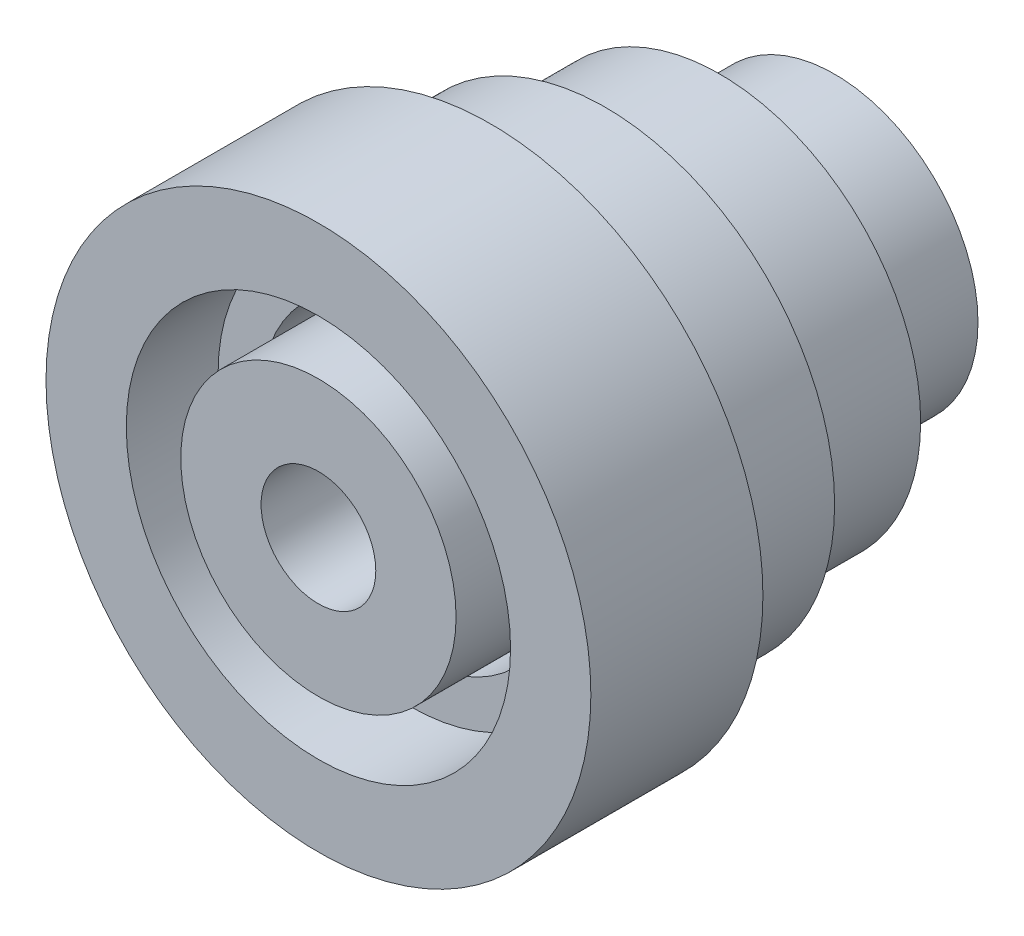
ISO-10303-21;
HEADER;
FILE_DESCRIPTION(('STEP AP214'),'2;1');
FILE_NAME('part.step','',(''),(''),'','','');
FILE_SCHEMA(('AUTOMOTIVE_DESIGN { 1 0 10303 214 1 1 1 1 }'));
ENDSEC;
DATA;
#1=APPLICATION_CONTEXT('core data for automotive mechanical design processes');
#2=APPLICATION_PROTOCOL_DEFINITION('international standard','automotive_design',2000,#1);
#3=PRODUCT_CONTEXT('',#1,'mechanical');
#4=PRODUCT('Part','Part','',(#3));
#5=PRODUCT_RELATED_PRODUCT_CATEGORY('part','',(#4));
#6=PRODUCT_DEFINITION_FORMATION('','',#4);
#7=PRODUCT_DEFINITION_CONTEXT('part definition',#1,'design');
#8=PRODUCT_DEFINITION('design','',#6,#7);
#9=PRODUCT_DEFINITION_SHAPE('','',#8);
#10=(LENGTH_UNIT() NAMED_UNIT(*) SI_UNIT(.MILLI.,.METRE.));
#11=(NAMED_UNIT(*) PLANE_ANGLE_UNIT() SI_UNIT($,.RADIAN.));
#12=(NAMED_UNIT(*) SI_UNIT($,.STERADIAN.) SOLID_ANGLE_UNIT());
#13=UNCERTAINTY_MEASURE_WITH_UNIT(LENGTH_MEASURE(1.E-05),#10,'distance_accuracy_value','');
#14=(GEOMETRIC_REPRESENTATION_CONTEXT(3) GLOBAL_UNCERTAINTY_ASSIGNED_CONTEXT((#13)) GLOBAL_UNIT_ASSIGNED_CONTEXT((#10,
#11,#12)) REPRESENTATION_CONTEXT('',''));
#15=CARTESIAN_POINT('',(0.,0.,0.));
#16=DIRECTION('',(0.,0.,1.));
#17=DIRECTION('',(1.,0.,0.));
#18=AXIS2_PLACEMENT_3D('',#15,#16,#17);
#19=CARTESIAN_POINT('',(0.,0.,0.));
#20=DIRECTION('',(0.,0.,1.));
#21=DIRECTION('',(1.,0.,0.));
#22=AXIS2_PLACEMENT_3D('',#19,#20,#21);
#23=CYLINDRICAL_SURFACE('',#22,48.);
#24=CARTESIAN_POINT('',(0.,0.,10.));
#25=DIRECTION('',(0.,0.,1.));
#26=DIRECTION('',(1.,0.,0.));
#27=AXIS2_PLACEMENT_3D('',#24,#25,#26);
#28=CIRCLE('',#27,48.);
#29=CARTESIAN_POINT('',(48.,0.,10.));
#30=VERTEX_POINT('',#29);
#31=EDGE_CURVE('E89',#30,#30,#28,.T.);
#32=ORIENTED_EDGE('',*,*,#31,.F.);
#33=EDGE_LOOP('',(#32));
#34=FACE_BOUND('',#33,.T.);
#35=CARTESIAN_POINT('',(0.,0.,-62.));
#36=DIRECTION('',(0.,0.,1.));
#37=DIRECTION('',(1.,0.,0.));
#38=AXIS2_PLACEMENT_3D('',#35,#36,#37);
#39=CIRCLE('',#38,48.);
#40=CARTESIAN_POINT('',(48.,0.,-62.));
#41=VERTEX_POINT('',#40);
#42=EDGE_CURVE('E10',#41,#41,#39,.T.);
#43=ORIENTED_EDGE('',*,*,#42,.T.);
#44=EDGE_LOOP('',(#43));
#45=FACE_BOUND('',#44,.T.);
#46=ADVANCED_FACE('F36',(#34,#45),#23,.T.);
#47=CARTESIAN_POINT('',(0.,0.,-62.));
#48=DIRECTION('',(0.,0.,-1.));
#49=DIRECTION('',(-1.,0.,0.));
#50=AXIS2_PLACEMENT_3D('',#47,#48,#49);
#51=PLANE('',#50);
#52=ORIENTED_EDGE('',*,*,#42,.F.);
#53=EDGE_LOOP('',(#52));
#54=FACE_BOUND('',#53,.T.);
#55=CARTESIAN_POINT('',(0.,0.,-62.));
#56=DIRECTION('',(0.,0.,1.));
#57=DIRECTION('',(1.,0.,0.));
#58=AXIS2_PLACEMENT_3D('',#55,#56,#57);
#59=CIRCLE('',#58,52.);
#60=CARTESIAN_POINT('',(52.,0.,-62.));
#61=VERTEX_POINT('',#60);
#62=EDGE_CURVE('E42',#61,#61,#59,.T.);
#63=ORIENTED_EDGE('',*,*,#62,.T.);
#64=EDGE_LOOP('',(#63));
#65=FACE_BOUND('',#64,.T.);
#66=ADVANCED_FACE('F234',(#54,#65),#51,.F.);
#67=CARTESIAN_POINT('',(0.,0.,0.));
#68=DIRECTION('',(0.,0.,1.));
#69=DIRECTION('',(1.,0.,0.));
#70=AXIS2_PLACEMENT_3D('',#67,#68,#69);
#71=CYLINDRICAL_SURFACE('',#70,52.);
#72=ORIENTED_EDGE('',*,*,#62,.F.);
#73=EDGE_LOOP('',(#72));
#74=FACE_BOUND('',#73,.T.);
#75=CARTESIAN_POINT('',(0.,0.,-22.));
#76=DIRECTION('',(0.,0.,1.));
#77=DIRECTION('',(1.,0.,0.));
#78=AXIS2_PLACEMENT_3D('',#75,#76,#77);
#79=CIRCLE('',#78,52.);
#80=CARTESIAN_POINT('',(52.,0.,-22.));
#81=VERTEX_POINT('',#80);
#82=EDGE_CURVE('E48',#81,#81,#79,.T.);
#83=ORIENTED_EDGE('',*,*,#82,.T.);
#84=EDGE_LOOP('',(#83));
#85=FACE_BOUND('',#84,.T.);
#86=ADVANCED_FACE('F235',(#74,#85),#71,.F.);
#87=CARTESIAN_POINT('',(0.,0.,-22.));
#88=DIRECTION('',(0.,0.,-1.));
#89=DIRECTION('',(-1.,0.,0.));
#90=AXIS2_PLACEMENT_3D('',#87,#88,#89);
#91=PLANE('',#90);
#92=ORIENTED_EDGE('',*,*,#82,.F.);
#93=EDGE_LOOP('',(#92));
#94=FACE_BOUND('',#93,.T.);
#95=CARTESIAN_POINT('',(0.,0.,-22.));
#96=DIRECTION('',(0.,0.,1.));
#97=DIRECTION('',(1.,0.,0.));
#98=AXIS2_PLACEMENT_3D('',#95,#96,#97);
#99=CIRCLE('',#98,67.);
#100=CARTESIAN_POINT('',(67.,0.,-22.));
#101=VERTEX_POINT('',#100);
#102=EDGE_CURVE('E55',#101,#101,#99,.T.);
#103=ORIENTED_EDGE('',*,*,#102,.T.);
#104=EDGE_LOOP('',(#103));
#105=FACE_BOUND('',#104,.T.);
#106=ADVANCED_FACE('F230',(#94,#105),#91,.F.);
#107=CARTESIAN_POINT('',(0.,0.,0.));
#108=DIRECTION('',(0.,0.,1.));
#109=DIRECTION('',(1.,0.,0.));
#110=AXIS2_PLACEMENT_3D('',#107,#108,#109);
#111=CYLINDRICAL_SURFACE('',#110,67.);
#112=ORIENTED_EDGE('',*,*,#102,.F.);
#113=EDGE_LOOP('',(#112));
#114=FACE_BOUND('',#113,.T.);
#115=CARTESIAN_POINT('',(0.,0.,10.));
#116=DIRECTION('',(0.,0.,1.));
#117=DIRECTION('',(1.,0.,0.));
#118=AXIS2_PLACEMENT_3D('',#115,#116,#117);
#119=CIRCLE('',#118,67.);
#120=CARTESIAN_POINT('',(67.,0.,10.));
#121=VERTEX_POINT('',#120);
#122=EDGE_CURVE('E60',#121,#121,#119,.T.);
#123=ORIENTED_EDGE('',*,*,#122,.T.);
#124=EDGE_LOOP('',(#123));
#125=FACE_BOUND('',#124,.T.);
#126=ADVANCED_FACE('F221',(#114,#125),#111,.F.);
#127=CARTESIAN_POINT('',(0.,0.,10.));
#128=DIRECTION('',(0.,0.,1.));
#129=DIRECTION('',(1.,0.,0.));
#130=AXIS2_PLACEMENT_3D('',#127,#128,#129);
#131=PLANE('',#130);
#132=CARTESIAN_POINT('',(0.,0.,10.));
#133=DIRECTION('',(0.,0.,1.));
#134=DIRECTION('',(1.,0.,0.));
#135=AXIS2_PLACEMENT_3D('',#132,#133,#134);
#136=CIRCLE('',#135,95.);
#137=CARTESIAN_POINT('',(95.,0.,10.));
#138=VERTEX_POINT('',#137);
#139=EDGE_CURVE('E58',#138,#138,#136,.T.);
#140=ORIENTED_EDGE('',*,*,#139,.T.);
#141=EDGE_LOOP('',(#140));
#142=FACE_BOUND('',#141,.T.);
#143=ORIENTED_EDGE('',*,*,#122,.F.);
#144=EDGE_LOOP('',(#143));
#145=FACE_BOUND('',#144,.T.);
#146=ADVANCED_FACE('F219',(#142,#145),#131,.T.);
#147=CARTESIAN_POINT('',(0.,0.,0.));
#148=DIRECTION('',(0.,0.,1.));
#149=DIRECTION('',(1.,0.,0.));
#150=AXIS2_PLACEMENT_3D('',#147,#148,#149);
#151=CYLINDRICAL_SURFACE('',#150,95.);
#152=CARTESIAN_POINT('',(0.,0.,-50.));
#153=DIRECTION('',(0.,0.,1.));
#154=DIRECTION('',(1.,0.,0.));
#155=AXIS2_PLACEMENT_3D('',#152,#153,#154);
#156=CIRCLE('',#155,95.);
#157=CARTESIAN_POINT('',(95.,0.,-50.));
#158=VERTEX_POINT('',#157);
#159=EDGE_CURVE('E65',#158,#158,#156,.T.);
#160=ORIENTED_EDGE('',*,*,#159,.T.);
#161=EDGE_LOOP('',(#160));
#162=FACE_BOUND('',#161,.T.);
#163=ORIENTED_EDGE('',*,*,#139,.F.);
#164=EDGE_LOOP('',(#163));
#165=FACE_BOUND('',#164,.T.);
#166=ADVANCED_FACE('F216',(#162,#165),#151,.T.);
#167=CARTESIAN_POINT('',(0.,0.,-50.));
#168=DIRECTION('',(0.,0.,-1.));
#169=DIRECTION('',(-1.,0.,0.));
#170=AXIS2_PLACEMENT_3D('',#167,#168,#169);
#171=PLANE('',#170);
#172=CARTESIAN_POINT('',(0.,0.,-50.));
#173=DIRECTION('',(0.,0.,1.));
#174=DIRECTION('',(1.,0.,0.));
#175=AXIS2_PLACEMENT_3D('',#172,#173,#174);
#176=CIRCLE('',#175,80.);
#177=CARTESIAN_POINT('',(80.,0.,-50.));
#178=VERTEX_POINT('',#177);
#179=EDGE_CURVE('E66',#178,#178,#176,.T.);
#180=ORIENTED_EDGE('',*,*,#179,.T.);
#181=EDGE_LOOP('',(#180));
#182=FACE_BOUND('',#181,.T.);
#183=ORIENTED_EDGE('',*,*,#159,.F.);
#184=EDGE_LOOP('',(#183));
#185=FACE_BOUND('',#184,.T.);
#186=ADVANCED_FACE('F215',(#182,#185),#171,.T.);
#187=CARTESIAN_POINT('',(0.,0.,0.));
#188=DIRECTION('',(0.,0.,1.));
#189=DIRECTION('',(1.,0.,0.));
#190=AXIS2_PLACEMENT_3D('',#187,#188,#189);
#191=CYLINDRICAL_SURFACE('',#190,80.);
#192=CARTESIAN_POINT('',(0.,0.,-90.));
#193=DIRECTION('',(0.,0.,1.));
#194=DIRECTION('',(1.,0.,0.));
#195=AXIS2_PLACEMENT_3D('',#192,#193,#194);
#196=CIRCLE('',#195,80.);
#197=CARTESIAN_POINT('',(80.,0.,-90.));
#198=VERTEX_POINT('',#197);
#199=EDGE_CURVE('E67',#198,#198,#196,.T.);
#200=ORIENTED_EDGE('',*,*,#199,.T.);
#201=EDGE_LOOP('',(#200));
#202=FACE_BOUND('',#201,.T.);
#203=ORIENTED_EDGE('',*,*,#179,.F.);
#204=EDGE_LOOP('',(#203));
#205=FACE_BOUND('',#204,.T.);
#206=ADVANCED_FACE('F208',(#202,#205),#191,.T.);
#207=CARTESIAN_POINT('',(0.,0.,-90.));
#208=DIRECTION('',(0.,0.,-1.));
#209=DIRECTION('',(-1.,0.,0.));
#210=AXIS2_PLACEMENT_3D('',#207,#208,#209);
#211=PLANE('',#210);
#212=CARTESIAN_POINT('',(0.,0.,-90.));
#213=DIRECTION('',(0.,0.,1.));
#214=DIRECTION('',(1.,0.,0.));
#215=AXIS2_PLACEMENT_3D('',#212,#213,#214);
#216=CIRCLE('',#215,70.);
#217=CARTESIAN_POINT('',(70.,0.,-90.));
#218=VERTEX_POINT('',#217);
#219=EDGE_CURVE('E75',#218,#218,#216,.T.);
#220=ORIENTED_EDGE('',*,*,#219,.T.);
#221=EDGE_LOOP('',(#220));
#222=FACE_BOUND('',#221,.T.);
#223=ORIENTED_EDGE('',*,*,#199,.F.);
#224=EDGE_LOOP('',(#223));
#225=FACE_BOUND('',#224,.T.);
#226=ADVANCED_FACE('F204',(#222,#225),#211,.T.);
#227=CARTESIAN_POINT('',(0.,0.,0.));
#228=DIRECTION('',(0.,0.,1.));
#229=DIRECTION('',(1.,0.,0.));
#230=AXIS2_PLACEMENT_3D('',#227,#228,#229);
#231=CYLINDRICAL_SURFACE('',#230,70.);
#232=CARTESIAN_POINT('',(0.,0.,-130.));
#233=DIRECTION('',(0.,0.,1.));
#234=DIRECTION('',(1.,0.,0.));
#235=AXIS2_PLACEMENT_3D('',#232,#233,#234);
#236=CIRCLE('',#235,70.);
#237=CARTESIAN_POINT('',(70.,0.,-130.));
#238=VERTEX_POINT('',#237);
#239=EDGE_CURVE('E73',#238,#238,#236,.T.);
#240=ORIENTED_EDGE('',*,*,#239,.T.);
#241=EDGE_LOOP('',(#240));
#242=FACE_BOUND('',#241,.T.);
#243=ORIENTED_EDGE('',*,*,#219,.F.);
#244=EDGE_LOOP('',(#243));
#245=FACE_BOUND('',#244,.T.);
#246=ADVANCED_FACE('F199',(#242,#245),#231,.T.);
#247=CARTESIAN_POINT('',(0.,0.,-130.));
#248=DIRECTION('',(0.,0.,-1.));
#249=DIRECTION('',(-1.,0.,0.));
#250=AXIS2_PLACEMENT_3D('',#247,#248,#249);
#251=PLANE('',#250);
#252=CARTESIAN_POINT('',(0.,0.,-130.));
#253=DIRECTION('',(0.,0.,1.));
#254=DIRECTION('',(1.,0.,0.));
#255=AXIS2_PLACEMENT_3D('',#252,#253,#254);
#256=CIRCLE('',#255,50.);
#257=CARTESIAN_POINT('',(50.,0.,-130.));
#258=VERTEX_POINT('',#257);
#259=EDGE_CURVE('E80',#258,#258,#256,.T.);
#260=ORIENTED_EDGE('',*,*,#259,.T.);
#261=EDGE_LOOP('',(#260));
#262=FACE_BOUND('',#261,.T.);
#263=ORIENTED_EDGE('',*,*,#239,.F.);
#264=EDGE_LOOP('',(#263));
#265=FACE_BOUND('',#264,.T.);
#266=ADVANCED_FACE('F198',(#262,#265),#251,.T.);
#267=CARTESIAN_POINT('',(0.,0.,0.));
#268=DIRECTION('',(0.,0.,1.));
#269=DIRECTION('',(1.,0.,0.));
#270=AXIS2_PLACEMENT_3D('',#267,#268,#269);
#271=CYLINDRICAL_SURFACE('',#270,50.);
#272=CARTESIAN_POINT('',(0.,0.,-170.));
#273=DIRECTION('',(0.,0.,1.));
#274=DIRECTION('',(1.,0.,0.));
#275=AXIS2_PLACEMENT_3D('',#272,#273,#274);
#276=CIRCLE('',#275,50.);
#277=CARTESIAN_POINT('',(50.,0.,-170.));
#278=VERTEX_POINT('',#277);
#279=EDGE_CURVE('E81',#278,#278,#276,.T.);
#280=ORIENTED_EDGE('',*,*,#279,.T.);
#281=EDGE_LOOP('',(#280));
#282=FACE_BOUND('',#281,.T.);
#283=ORIENTED_EDGE('',*,*,#259,.F.);
#284=EDGE_LOOP('',(#283));
#285=FACE_BOUND('',#284,.T.);
#286=ADVANCED_FACE('F195',(#282,#285),#271,.T.);
#287=CARTESIAN_POINT('',(4.71844785465693E-13,0.,-170.));
#288=DIRECTION('',(0.,0.,-1.));
#289=DIRECTION('',(-1.,0.,0.));
#290=AXIS2_PLACEMENT_3D('',#287,#288,#289);
#291=PLANE('',#290);
#292=CARTESIAN_POINT('',(0.,0.,-170.));
#293=DIRECTION('',(0.,0.,1.));
#294=DIRECTION('',(1.,0.,0.));
#295=AXIS2_PLACEMENT_3D('',#292,#293,#294);
#296=CIRCLE('',#295,20.);
#297=CARTESIAN_POINT('',(20.,0.,-170.));
#298=VERTEX_POINT('',#297);
#299=EDGE_CURVE('E82',#298,#298,#296,.T.);
#300=ORIENTED_EDGE('',*,*,#299,.T.);
#301=EDGE_LOOP('',(#300));
#302=FACE_BOUND('',#301,.T.);
#303=ORIENTED_EDGE('',*,*,#279,.F.);
#304=EDGE_LOOP('',(#303));
#305=FACE_BOUND('',#304,.T.);
#306=ADVANCED_FACE('F190',(#302,#305),#291,.T.);
#307=CARTESIAN_POINT('',(0.,0.,0.));
#308=DIRECTION('',(0.,0.,1.));
#309=DIRECTION('',(1.,0.,0.));
#310=AXIS2_PLACEMENT_3D('',#307,#308,#309);
#311=CYLINDRICAL_SURFACE('',#310,20.);
#312=ORIENTED_EDGE('',*,*,#299,.F.);
#313=EDGE_LOOP('',(#312));
#314=FACE_BOUND('',#313,.T.);
#315=CARTESIAN_POINT('',(0.,0.,10.));
#316=DIRECTION('',(0.,0.,1.));
#317=DIRECTION('',(1.,0.,0.));
#318=AXIS2_PLACEMENT_3D('',#315,#316,#317);
#319=CIRCLE('',#318,20.);
#320=CARTESIAN_POINT('',(20.,0.,10.));
#321=VERTEX_POINT('',#320);
#322=EDGE_CURVE('E87',#321,#321,#319,.T.);
#323=ORIENTED_EDGE('',*,*,#322,.T.);
#324=EDGE_LOOP('',(#323));
#325=FACE_BOUND('',#324,.T.);
#326=ADVANCED_FACE('F184',(#314,#325),#311,.F.);
#327=CARTESIAN_POINT('',(0.,0.,10.));
#328=DIRECTION('',(0.,0.,1.));
#329=DIRECTION('',(1.,0.,0.));
#330=AXIS2_PLACEMENT_3D('',#327,#328,#329);
#331=PLANE('',#330);
#332=ORIENTED_EDGE('',*,*,#31,.T.);
#333=EDGE_LOOP('',(#332));
#334=FACE_BOUND('',#333,.T.);
#335=ORIENTED_EDGE('',*,*,#322,.F.);
#336=EDGE_LOOP('',(#335));
#337=FACE_BOUND('',#336,.T.);
#338=ADVANCED_FACE('F185',(#334,#337),#331,.T.);
#339=CLOSED_SHELL('',(#46,#66,#86,#106,#126,#146,#166,#186,#206,#226,#246,#266,#286,#306,#326,#338));
#340=CARTESIAN_POINT('',(0.,0.,0.));
#341=DIRECTION('',(0.,0.,1.));
#342=DIRECTION('',(1.,0.,0.));
#343=AXIS2_PLACEMENT_3D('',#340,#341,#342);
#344=CYLINDRICAL_SURFACE('',#343,38.);
#345=CARTESIAN_POINT('',(0.,0.,0.));
#346=DIRECTION('',(0.,0.,1.));
#347=DIRECTION('',(1.,0.,0.));
#348=AXIS2_PLACEMENT_3D('',#345,#346,#347);
#349=CIRCLE('',#348,38.);
#350=CARTESIAN_POINT('',(38.,0.,0.));
#351=VERTEX_POINT('',#350);
#352=EDGE_CURVE('E145',#351,#351,#349,.T.);
#353=ORIENTED_EDGE('',*,*,#352,.T.);
#354=EDGE_LOOP('',(#353));
#355=FACE_BOUND('',#354,.T.);
#356=CARTESIAN_POINT('',(0.,0.,-112.));
#357=DIRECTION('',(0.,0.,1.));
#358=DIRECTION('',(1.,0.,0.));
#359=AXIS2_PLACEMENT_3D('',#356,#357,#358);
#360=CIRCLE('',#359,38.);
#361=CARTESIAN_POINT('',(38.,0.,-112.));
#362=VERTEX_POINT('',#361);
#363=EDGE_CURVE('E91',#362,#362,#360,.T.);
#364=ORIENTED_EDGE('',*,*,#363,.F.);
#365=EDGE_LOOP('',(#364));
#366=FACE_BOUND('',#365,.T.);
#367=ADVANCED_FACE('F146',(#355,#366),#344,.F.);
#368=CARTESIAN_POINT('',(0.,0.,-112.));
#369=DIRECTION('',(0.,0.,-1.));
#370=DIRECTION('',(-1.,0.,0.));
#371=AXIS2_PLACEMENT_3D('',#368,#369,#370);
#372=PLANE('',#371);
#373=ORIENTED_EDGE('',*,*,#363,.T.);
#374=EDGE_LOOP('',(#373));
#375=FACE_BOUND('',#374,.T.);
#376=CARTESIAN_POINT('',(0.,0.,-112.));
#377=DIRECTION('',(0.,0.,1.));
#378=DIRECTION('',(1.,0.,0.));
#379=AXIS2_PLACEMENT_3D('',#376,#377,#378);
#380=CIRCLE('',#379,52.);
#381=CARTESIAN_POINT('',(52.,0.,-112.));
#382=VERTEX_POINT('',#381);
#383=EDGE_CURVE('E96',#382,#382,#380,.T.);
#384=ORIENTED_EDGE('',*,*,#383,.F.);
#385=EDGE_LOOP('',(#384));
#386=FACE_BOUND('',#385,.T.);
#387=ADVANCED_FACE('F174',(#375,#386),#372,.T.);
#388=CARTESIAN_POINT('',(0.,0.,0.));
#389=DIRECTION('',(0.,0.,1.));
#390=DIRECTION('',(1.,0.,0.));
#391=AXIS2_PLACEMENT_3D('',#388,#389,#390);
#392=CYLINDRICAL_SURFACE('',#391,52.);
#393=ORIENTED_EDGE('',*,*,#383,.T.);
#394=EDGE_LOOP('',(#393));
#395=FACE_BOUND('',#394,.T.);
#396=CARTESIAN_POINT('',(0.,0.,-72.));
#397=DIRECTION('',(0.,0.,1.));
#398=DIRECTION('',(1.,0.,0.));
#399=AXIS2_PLACEMENT_3D('',#396,#397,#398);
#400=CIRCLE('',#399,52.);
#401=CARTESIAN_POINT('',(52.,0.,-72.));
#402=VERTEX_POINT('',#401);
#403=EDGE_CURVE('E97',#402,#402,#400,.T.);
#404=ORIENTED_EDGE('',*,*,#403,.F.);
#405=EDGE_LOOP('',(#404));
#406=FACE_BOUND('',#405,.T.);
#407=ADVANCED_FACE('F180',(#395,#406),#392,.T.);
#408=CARTESIAN_POINT('',(0.,0.,-72.));
#409=DIRECTION('',(0.,0.,-1.));
#410=DIRECTION('',(-1.,0.,0.));
#411=AXIS2_PLACEMENT_3D('',#408,#409,#410);
#412=PLANE('',#411);
#413=ORIENTED_EDGE('',*,*,#403,.T.);
#414=EDGE_LOOP('',(#413));
#415=FACE_BOUND('',#414,.T.);
#416=CARTESIAN_POINT('',(0.,0.,-72.));
#417=DIRECTION('',(0.,0.,1.));
#418=DIRECTION('',(1.,0.,0.));
#419=AXIS2_PLACEMENT_3D('',#416,#417,#418);
#420=CIRCLE('',#419,62.);
#421=CARTESIAN_POINT('',(62.,0.,-72.));
#422=VERTEX_POINT('',#421);
#423=EDGE_CURVE('E105',#422,#422,#420,.T.);
#424=ORIENTED_EDGE('',*,*,#423,.F.);
#425=EDGE_LOOP('',(#424));
#426=FACE_BOUND('',#425,.T.);
#427=ADVANCED_FACE('F360',(#415,#426),#412,.T.);
#428=CARTESIAN_POINT('',(0.,0.,0.));
#429=DIRECTION('',(0.,0.,1.));
#430=DIRECTION('',(1.,0.,0.));
#431=AXIS2_PLACEMENT_3D('',#428,#429,#430);
#432=CYLINDRICAL_SURFACE('',#431,62.);
#433=ORIENTED_EDGE('',*,*,#423,.T.);
#434=EDGE_LOOP('',(#433));
#435=FACE_BOUND('',#434,.T.);
#436=CARTESIAN_POINT('',(0.,0.,-32.));
#437=DIRECTION('',(0.,0.,1.));
#438=DIRECTION('',(1.,0.,0.));
#439=AXIS2_PLACEMENT_3D('',#436,#437,#438);
#440=CIRCLE('',#439,62.);
#441=CARTESIAN_POINT('',(62.,0.,-32.));
#442=VERTEX_POINT('',#441);
#443=EDGE_CURVE('E104',#442,#442,#440,.T.);
#444=ORIENTED_EDGE('',*,*,#443,.F.);
#445=EDGE_LOOP('',(#444));
#446=FACE_BOUND('',#445,.T.);
#447=ADVANCED_FACE('F368',(#435,#446),#432,.T.);
#448=CARTESIAN_POINT('',(0.,0.,-32.));
#449=DIRECTION('',(0.,0.,-1.));
#450=DIRECTION('',(-1.,0.,0.));
#451=AXIS2_PLACEMENT_3D('',#448,#449,#450);
#452=PLANE('',#451);
#453=ORIENTED_EDGE('',*,*,#443,.T.);
#454=EDGE_LOOP('',(#453));
#455=FACE_BOUND('',#454,.T.);
#456=CARTESIAN_POINT('',(0.,0.,-32.));
#457=DIRECTION('',(0.,0.,1.));
#458=DIRECTION('',(1.,0.,0.));
#459=AXIS2_PLACEMENT_3D('',#456,#457,#458);
#460=CIRCLE('',#459,77.);
#461=CARTESIAN_POINT('',(77.,0.,-32.));
#462=VERTEX_POINT('',#461);
#463=EDGE_CURVE('E107',#462,#462,#460,.T.);
#464=ORIENTED_EDGE('',*,*,#463,.F.);
#465=EDGE_LOOP('',(#464));
#466=FACE_BOUND('',#465,.T.);
#467=ADVANCED_FACE('F376',(#455,#466),#452,.T.);
#468=CARTESIAN_POINT('',(0.,0.,0.));
#469=DIRECTION('',(0.,0.,1.));
#470=DIRECTION('',(1.,0.,0.));
#471=AXIS2_PLACEMENT_3D('',#468,#469,#470);
#472=CYLINDRICAL_SURFACE('',#471,77.);
#473=ORIENTED_EDGE('',*,*,#463,.T.);
#474=EDGE_LOOP('',(#473));
#475=FACE_BOUND('',#474,.T.);
#476=CARTESIAN_POINT('',(0.,0.,0.));
#477=DIRECTION('',(0.,0.,1.));
#478=DIRECTION('',(1.,0.,0.));
#479=AXIS2_PLACEMENT_3D('',#476,#477,#478);
#480=CIRCLE('',#479,77.);
#481=CARTESIAN_POINT('',(77.,0.,0.));
#482=VERTEX_POINT('',#481);
#483=EDGE_CURVE('E112',#482,#482,#480,.T.);
#484=ORIENTED_EDGE('',*,*,#483,.F.);
#485=EDGE_LOOP('',(#484));
#486=FACE_BOUND('',#485,.T.);
#487=ADVANCED_FACE('F387',(#475,#486),#472,.T.);
#488=CARTESIAN_POINT('',(0.,0.,0.));
#489=DIRECTION('',(0.,0.,1.));
#490=DIRECTION('',(1.,0.,0.));
#491=AXIS2_PLACEMENT_3D('',#488,#489,#490);
#492=PLANE('',#491);
#493=CARTESIAN_POINT('',(0.,0.,0.));
#494=DIRECTION('',(0.,0.,1.));
#495=DIRECTION('',(1.,0.,0.));
#496=AXIS2_PLACEMENT_3D('',#493,#494,#495);
#497=CIRCLE('',#496,85.);
#498=CARTESIAN_POINT('',(85.,0.,0.));
#499=VERTEX_POINT('',#498);
#500=EDGE_CURVE('E111',#499,#499,#497,.T.);
#501=ORIENTED_EDGE('',*,*,#500,.F.);
#502=EDGE_LOOP('',(#501));
#503=FACE_BOUND('',#502,.T.);
#504=ORIENTED_EDGE('',*,*,#483,.T.);
#505=EDGE_LOOP('',(#504));
#506=FACE_BOUND('',#505,.T.);
#507=ADVANCED_FACE('F396',(#503,#506),#492,.F.);
#508=CARTESIAN_POINT('',(0.,0.,0.));
#509=DIRECTION('',(0.,0.,1.));
#510=DIRECTION('',(1.,0.,0.));
#511=AXIS2_PLACEMENT_3D('',#508,#509,#510);
#512=CYLINDRICAL_SURFACE('',#511,85.);
#513=CARTESIAN_POINT('',(0.,0.,-40.));
#514=DIRECTION('',(0.,0.,1.));
#515=DIRECTION('',(1.,0.,0.));
#516=AXIS2_PLACEMENT_3D('',#513,#514,#515);
#517=CIRCLE('',#516,85.);
#518=CARTESIAN_POINT('',(85.,0.,-40.));
#519=VERTEX_POINT('',#518);
#520=EDGE_CURVE('E116',#519,#519,#517,.T.);
#521=ORIENTED_EDGE('',*,*,#520,.F.);
#522=EDGE_LOOP('',(#521));
#523=FACE_BOUND('',#522,.T.);
#524=ORIENTED_EDGE('',*,*,#500,.T.);
#525=EDGE_LOOP('',(#524));
#526=FACE_BOUND('',#525,.T.);
#527=ADVANCED_FACE('F409',(#523,#526),#512,.F.);
#528=CARTESIAN_POINT('',(0.,0.,-40.));
#529=DIRECTION('',(0.,0.,-1.));
#530=DIRECTION('',(-1.,0.,0.));
#531=AXIS2_PLACEMENT_3D('',#528,#529,#530);
#532=PLANE('',#531);
#533=CARTESIAN_POINT('',(0.,0.,-40.));
#534=DIRECTION('',(0.,0.,1.));
#535=DIRECTION('',(1.,0.,0.));
#536=AXIS2_PLACEMENT_3D('',#533,#534,#535);
#537=CIRCLE('',#536,70.);
#538=CARTESIAN_POINT('',(70.,0.,-40.));
#539=VERTEX_POINT('',#538);
#540=EDGE_CURVE('E117',#539,#539,#537,.T.);
#541=ORIENTED_EDGE('',*,*,#540,.F.);
#542=EDGE_LOOP('',(#541));
#543=FACE_BOUND('',#542,.T.);
#544=ORIENTED_EDGE('',*,*,#520,.T.);
#545=EDGE_LOOP('',(#544));
#546=FACE_BOUND('',#545,.T.);
#547=ADVANCED_FACE('F418',(#543,#546),#532,.F.);
#548=CARTESIAN_POINT('',(0.,0.,0.));
#549=DIRECTION('',(0.,0.,1.));
#550=DIRECTION('',(1.,0.,0.));
#551=AXIS2_PLACEMENT_3D('',#548,#549,#550);
#552=CYLINDRICAL_SURFACE('',#551,70.);
#553=CARTESIAN_POINT('',(0.,0.,-80.));
#554=DIRECTION('',(0.,0.,1.));
#555=DIRECTION('',(1.,0.,0.));
#556=AXIS2_PLACEMENT_3D('',#553,#554,#555);
#557=CIRCLE('',#556,70.);
#558=CARTESIAN_POINT('',(70.,0.,-80.));
#559=VERTEX_POINT('',#558);
#560=EDGE_CURVE('E123',#559,#559,#557,.T.);
#561=ORIENTED_EDGE('',*,*,#560,.F.);
#562=EDGE_LOOP('',(#561));
#563=FACE_BOUND('',#562,.T.);
#564=ORIENTED_EDGE('',*,*,#540,.T.);
#565=EDGE_LOOP('',(#564));
#566=FACE_BOUND('',#565,.T.);
#567=ADVANCED_FACE('F426',(#563,#566),#552,.F.);
#568=CARTESIAN_POINT('',(0.,0.,-80.));
#569=DIRECTION('',(0.,0.,-1.));
#570=DIRECTION('',(-1.,0.,0.));
#571=AXIS2_PLACEMENT_3D('',#568,#569,#570);
#572=PLANE('',#571);
#573=CARTESIAN_POINT('',(0.,0.,-80.));
#574=DIRECTION('',(0.,0.,1.));
#575=DIRECTION('',(1.,0.,0.));
#576=AXIS2_PLACEMENT_3D('',#573,#574,#575);
#577=CIRCLE('',#576,60.);
#578=CARTESIAN_POINT('',(60.,0.,-80.));
#579=VERTEX_POINT('',#578);
#580=EDGE_CURVE('E127',#579,#579,#577,.T.);
#581=ORIENTED_EDGE('',*,*,#580,.F.);
#582=EDGE_LOOP('',(#581));
#583=FACE_BOUND('',#582,.T.);
#584=ORIENTED_EDGE('',*,*,#560,.T.);
#585=EDGE_LOOP('',(#584));
#586=FACE_BOUND('',#585,.T.);
#587=ADVANCED_FACE('F436',(#583,#586),#572,.F.);
#588=CARTESIAN_POINT('',(0.,0.,0.));
#589=DIRECTION('',(0.,0.,1.));
#590=DIRECTION('',(1.,0.,0.));
#591=AXIS2_PLACEMENT_3D('',#588,#589,#590);
#592=CYLINDRICAL_SURFACE('',#591,60.);
#593=CARTESIAN_POINT('',(0.,0.,-120.));
#594=DIRECTION('',(0.,0.,1.));
#595=DIRECTION('',(1.,0.,0.));
#596=AXIS2_PLACEMENT_3D('',#593,#594,#595);
#597=CIRCLE('',#596,60.);
#598=CARTESIAN_POINT('',(60.,0.,-120.));
#599=VERTEX_POINT('',#598);
#600=EDGE_CURVE('E129',#599,#599,#597,.T.);
#601=ORIENTED_EDGE('',*,*,#600,.F.);
#602=EDGE_LOOP('',(#601));
#603=FACE_BOUND('',#602,.T.);
#604=ORIENTED_EDGE('',*,*,#580,.T.);
#605=EDGE_LOOP('',(#604));
#606=FACE_BOUND('',#605,.T.);
#607=ADVANCED_FACE('F449',(#603,#606),#592,.F.);
#608=CARTESIAN_POINT('',(0.,0.,-120.));
#609=DIRECTION('',(0.,0.,-1.));
#610=DIRECTION('',(-1.,0.,0.));
#611=AXIS2_PLACEMENT_3D('',#608,#609,#610);
#612=PLANE('',#611);
#613=CARTESIAN_POINT('',(0.,0.,-120.));
#614=DIRECTION('',(0.,0.,1.));
#615=DIRECTION('',(1.,0.,0.));
#616=AXIS2_PLACEMENT_3D('',#613,#614,#615);
#617=CIRCLE('',#616,40.);
#618=CARTESIAN_POINT('',(40.,0.,-120.));
#619=VERTEX_POINT('',#618);
#620=EDGE_CURVE('E131',#619,#619,#617,.T.);
#621=ORIENTED_EDGE('',*,*,#620,.F.);
#622=EDGE_LOOP('',(#621));
#623=FACE_BOUND('',#622,.T.);
#624=ORIENTED_EDGE('',*,*,#600,.T.);
#625=EDGE_LOOP('',(#624));
#626=FACE_BOUND('',#625,.T.);
#627=ADVANCED_FACE('F457',(#623,#626),#612,.F.);
#628=CARTESIAN_POINT('',(0.,0.,0.));
#629=DIRECTION('',(0.,0.,1.));
#630=DIRECTION('',(1.,0.,0.));
#631=AXIS2_PLACEMENT_3D('',#628,#629,#630);
#632=CYLINDRICAL_SURFACE('',#631,40.);
#633=CARTESIAN_POINT('',(0.,0.,-160.));
#634=DIRECTION('',(0.,0.,1.));
#635=DIRECTION('',(1.,0.,0.));
#636=AXIS2_PLACEMENT_3D('',#633,#634,#635);
#637=CIRCLE('',#636,40.);
#638=CARTESIAN_POINT('',(40.,0.,-160.));
#639=VERTEX_POINT('',#638);
#640=EDGE_CURVE('E132',#639,#639,#637,.T.);
#641=ORIENTED_EDGE('',*,*,#640,.F.);
#642=EDGE_LOOP('',(#641));
#643=FACE_BOUND('',#642,.T.);
#644=ORIENTED_EDGE('',*,*,#620,.T.);
#645=EDGE_LOOP('',(#644));
#646=FACE_BOUND('',#645,.T.);
#647=ADVANCED_FACE('F167',(#643,#646),#632,.F.);
#648=CARTESIAN_POINT('',(4.44089209850064E-13,0.,-160.));
#649=DIRECTION('',(0.,0.,-1.));
#650=DIRECTION('',(-1.,0.,0.));
#651=AXIS2_PLACEMENT_3D('',#648,#649,#650);
#652=PLANE('',#651);
#653=CARTESIAN_POINT('',(0.,0.,-160.));
#654=DIRECTION('',(0.,0.,1.));
#655=DIRECTION('',(1.,0.,0.));
#656=AXIS2_PLACEMENT_3D('',#653,#654,#655);
#657=CIRCLE('',#656,30.);
#658=CARTESIAN_POINT('',(30.,0.,-160.));
#659=VERTEX_POINT('',#658);
#660=EDGE_CURVE('E138',#659,#659,#657,.T.);
#661=ORIENTED_EDGE('',*,*,#660,.F.);
#662=EDGE_LOOP('',(#661));
#663=FACE_BOUND('',#662,.T.);
#664=ORIENTED_EDGE('',*,*,#640,.T.);
#665=EDGE_LOOP('',(#664));
#666=FACE_BOUND('',#665,.T.);
#667=ADVANCED_FACE('F159',(#663,#666),#652,.F.);
#668=CARTESIAN_POINT('',(0.,0.,0.));
#669=DIRECTION('',(0.,0.,1.));
#670=DIRECTION('',(1.,0.,0.));
#671=AXIS2_PLACEMENT_3D('',#668,#669,#670);
#672=CYLINDRICAL_SURFACE('',#671,30.);
#673=ORIENTED_EDGE('',*,*,#660,.T.);
#674=EDGE_LOOP('',(#673));
#675=FACE_BOUND('',#674,.T.);
#676=CARTESIAN_POINT('',(0.,0.,0.));
#677=DIRECTION('',(0.,0.,1.));
#678=DIRECTION('',(1.,0.,0.));
#679=AXIS2_PLACEMENT_3D('',#676,#677,#678);
#680=CIRCLE('',#679,30.);
#681=CARTESIAN_POINT('',(30.,0.,0.));
#682=VERTEX_POINT('',#681);
#683=EDGE_CURVE('E143',#682,#682,#680,.T.);
#684=ORIENTED_EDGE('',*,*,#683,.F.);
#685=EDGE_LOOP('',(#684));
#686=FACE_BOUND('',#685,.T.);
#687=ADVANCED_FACE('F152',(#675,#686),#672,.T.);
#688=CARTESIAN_POINT('',(0.,0.,0.));
#689=DIRECTION('',(0.,0.,1.));
#690=DIRECTION('',(1.,0.,0.));
#691=AXIS2_PLACEMENT_3D('',#688,#689,#690);
#692=PLANE('',#691);
#693=ORIENTED_EDGE('',*,*,#352,.F.);
#694=EDGE_LOOP('',(#693));
#695=FACE_BOUND('',#694,.T.);
#696=ORIENTED_EDGE('',*,*,#683,.T.);
#697=EDGE_LOOP('',(#696));
#698=FACE_BOUND('',#697,.T.);
#699=ADVANCED_FACE('F151',(#695,#698),#692,.F.);
#700=CLOSED_SHELL('',(#367,#387,#407,#427,#447,#467,#487,#507,#527,#547,#567,#587,#607,#627,
#647,#667,#687,#699));
#701=ORIENTED_CLOSED_SHELL('',*,#700,.T.);
#702=BREP_WITH_VOIDS('B2',#339,(#701));
#703=ADVANCED_BREP_SHAPE_REPRESENTATION('',(#18,#702),#14);
#704=SHAPE_DEFINITION_REPRESENTATION(#9,#703);
ENDSEC;
END-ISO-10303-21;
